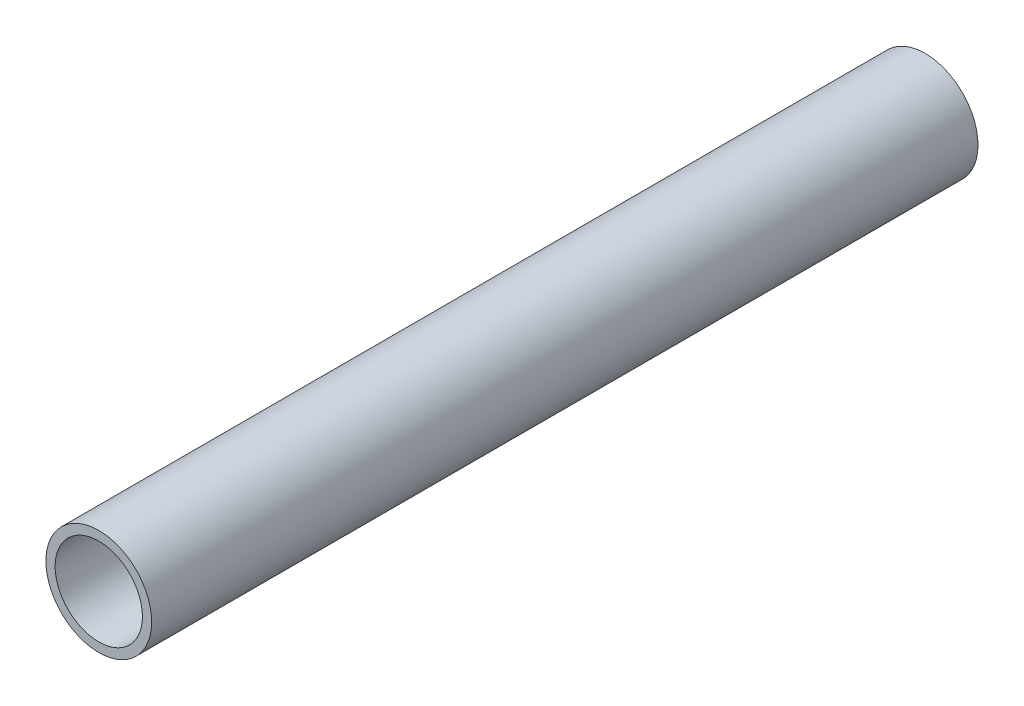
ISO-10303-21;
HEADER;
FILE_DESCRIPTION(('STEP AP214'),'2;1');
FILE_NAME('part.step','',(''),(''),'','','');
FILE_SCHEMA(('AUTOMOTIVE_DESIGN { 1 0 10303 214 1 1 1 1 }'));
ENDSEC;
DATA;
#1=APPLICATION_CONTEXT('core data for automotive mechanical design processes');
#2=APPLICATION_PROTOCOL_DEFINITION('international standard','automotive_design',2000,#1);
#3=PRODUCT_CONTEXT('',#1,'mechanical');
#4=PRODUCT('Part','Part','',(#3));
#5=PRODUCT_RELATED_PRODUCT_CATEGORY('part','',(#4));
#6=PRODUCT_DEFINITION_FORMATION('','',#4);
#7=PRODUCT_DEFINITION_CONTEXT('part definition',#1,'design');
#8=PRODUCT_DEFINITION('design','',#6,#7);
#9=PRODUCT_DEFINITION_SHAPE('','',#8);
#10=(LENGTH_UNIT() NAMED_UNIT(*) SI_UNIT(.MILLI.,.METRE.));
#11=(NAMED_UNIT(*) PLANE_ANGLE_UNIT() SI_UNIT($,.RADIAN.));
#12=(NAMED_UNIT(*) SI_UNIT($,.STERADIAN.) SOLID_ANGLE_UNIT());
#13=UNCERTAINTY_MEASURE_WITH_UNIT(LENGTH_MEASURE(1.E-05),#10,'distance_accuracy_value','');
#14=(GEOMETRIC_REPRESENTATION_CONTEXT(3) GLOBAL_UNCERTAINTY_ASSIGNED_CONTEXT((#13)) GLOBAL_UNIT_ASSIGNED_CONTEXT((#10,
#11,#12)) REPRESENTATION_CONTEXT('',''));
#15=CARTESIAN_POINT('',(0.,0.,0.));
#16=DIRECTION('',(0.,0.,1.));
#17=DIRECTION('',(1.,0.,0.));
#18=AXIS2_PLACEMENT_3D('',#15,#16,#17);
#19=CARTESIAN_POINT('',(0.,0.,170.35));
#20=DIRECTION('',(0.,0.,1.));
#21=DIRECTION('',(1.,0.,0.));
#22=AXIS2_PLACEMENT_3D('',#19,#20,#21);
#23=PLANE('',#22);
#24=CARTESIAN_POINT('',(0.,0.,170.35));
#25=DIRECTION('',(0.,0.,1.));
#26=DIRECTION('',(1.,0.,0.));
#27=AXIS2_PLACEMENT_3D('',#24,#25,#26);
#28=CIRCLE('',#27,10.9);
#29=CARTESIAN_POINT('',(10.9,0.,170.35));
#30=VERTEX_POINT('',#29);
#31=EDGE_CURVE('E10',#30,#30,#28,.T.);
#32=ORIENTED_EDGE('',*,*,#31,.T.);
#33=EDGE_LOOP('',(#32));
#34=FACE_BOUND('',#33,.T.);
#35=CARTESIAN_POINT('',(0.,0.,170.35));
#36=DIRECTION('',(0.,0.,1.));
#37=DIRECTION('',(1.,0.,0.));
#38=AXIS2_PLACEMENT_3D('',#35,#36,#37);
#39=CIRCLE('',#38,9.);
#40=CARTESIAN_POINT('',(9.,0.,170.35));
#41=VERTEX_POINT('',#40);
#42=EDGE_CURVE('E41',#41,#41,#39,.T.);
#43=ORIENTED_EDGE('',*,*,#42,.F.);
#44=EDGE_LOOP('',(#43));
#45=FACE_BOUND('',#44,.T.);
#46=ADVANCED_FACE('F30',(#34,#45),#23,.T.);
#47=CARTESIAN_POINT('',(0.,0.,0.));
#48=DIRECTION('',(0.,0.,1.));
#49=DIRECTION('',(1.,0.,0.));
#50=AXIS2_PLACEMENT_3D('',#47,#48,#49);
#51=PLANE('',#50);
#52=CARTESIAN_POINT('',(0.,0.,0.));
#53=DIRECTION('',(0.,0.,1.));
#54=DIRECTION('',(1.,0.,0.));
#55=AXIS2_PLACEMENT_3D('',#52,#53,#54);
#56=CIRCLE('',#55,10.9);
#57=CARTESIAN_POINT('',(10.9,0.,0.));
#58=VERTEX_POINT('',#57);
#59=EDGE_CURVE('E34',#58,#58,#56,.T.);
#60=ORIENTED_EDGE('',*,*,#59,.F.);
#61=EDGE_LOOP('',(#60));
#62=FACE_BOUND('',#61,.T.);
#63=CARTESIAN_POINT('',(0.,0.,0.));
#64=DIRECTION('',(0.,0.,1.));
#65=DIRECTION('',(1.,0.,0.));
#66=AXIS2_PLACEMENT_3D('',#63,#64,#65);
#67=CIRCLE('',#66,9.);
#68=CARTESIAN_POINT('',(9.,0.,0.));
#69=VERTEX_POINT('',#68);
#70=EDGE_CURVE('E43',#69,#69,#67,.T.);
#71=ORIENTED_EDGE('',*,*,#70,.T.);
#72=EDGE_LOOP('',(#71));
#73=FACE_BOUND('',#72,.T.);
#74=ADVANCED_FACE('F53',(#62,#73),#51,.F.);
#75=CARTESIAN_POINT('',(0.,0.,170.35));
#76=DIRECTION('',(0.,0.,-1.));
#77=DIRECTION('',(-1.,0.,0.));
#78=AXIS2_PLACEMENT_3D('',#75,#76,#77);
#79=CYLINDRICAL_SURFACE('',#78,10.9);
#80=ORIENTED_EDGE('',*,*,#31,.F.);
#81=EDGE_LOOP('',(#80));
#82=FACE_BOUND('',#81,.T.);
#83=ORIENTED_EDGE('',*,*,#59,.T.);
#84=EDGE_LOOP('',(#83));
#85=FACE_BOUND('',#84,.T.);
#86=ADVANCED_FACE('F32',(#82,#85),#79,.T.);
#87=CARTESIAN_POINT('',(0.,0.,170.35));
#88=DIRECTION('',(0.,0.,-1.));
#89=DIRECTION('',(-1.,0.,0.));
#90=AXIS2_PLACEMENT_3D('',#87,#88,#89);
#91=CYLINDRICAL_SURFACE('',#90,9.);
#92=ORIENTED_EDGE('',*,*,#42,.T.);
#93=EDGE_LOOP('',(#92));
#94=FACE_BOUND('',#93,.T.);
#95=ORIENTED_EDGE('',*,*,#70,.F.);
#96=EDGE_LOOP('',(#95));
#97=FACE_BOUND('',#96,.T.);
#98=ADVANCED_FACE('F49',(#94,#97),#91,.F.);
#99=CLOSED_SHELL('',(#46,#74,#86,#98));
#100=MANIFOLD_SOLID_BREP('B2',#99);
#101=ADVANCED_BREP_SHAPE_REPRESENTATION('',(#18,#100),#14);
#102=SHAPE_DEFINITION_REPRESENTATION(#9,#101);
ENDSEC;
END-ISO-10303-21;
